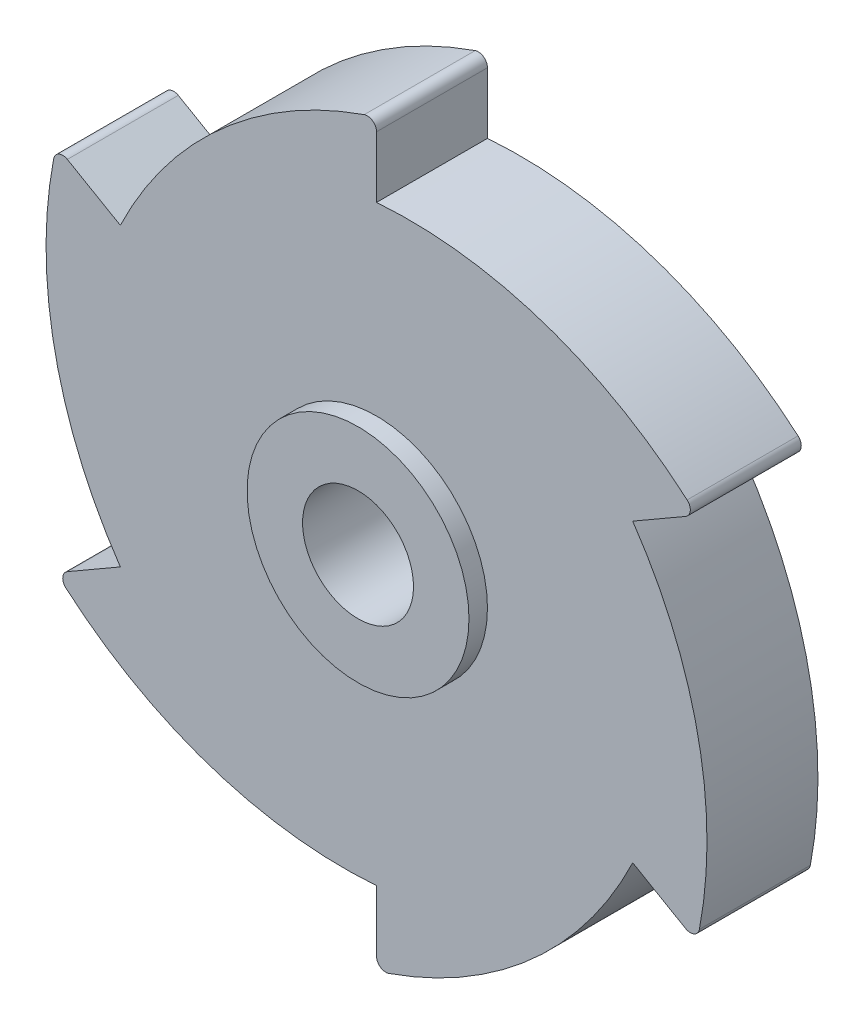
ISO-10303-21;
HEADER;
FILE_DESCRIPTION(('STEP AP214'),'2;1');
FILE_NAME('part.step','',(''),(''),'','','');
FILE_SCHEMA(('AUTOMOTIVE_DESIGN { 1 0 10303 214 1 1 1 1 }'));
ENDSEC;
DATA;
#1=APPLICATION_CONTEXT('core data for automotive mechanical design processes');
#2=APPLICATION_PROTOCOL_DEFINITION('international standard','automotive_design',2000,#1);
#3=PRODUCT_CONTEXT('',#1,'mechanical');
#4=PRODUCT('Part','Part','',(#3));
#5=PRODUCT_RELATED_PRODUCT_CATEGORY('part','',(#4));
#6=PRODUCT_DEFINITION_FORMATION('','',#4);
#7=PRODUCT_DEFINITION_CONTEXT('part definition',#1,'design');
#8=PRODUCT_DEFINITION('design','',#6,#7);
#9=PRODUCT_DEFINITION_SHAPE('','',#8);
#10=(LENGTH_UNIT() NAMED_UNIT(*) SI_UNIT(.MILLI.,.METRE.));
#11=(NAMED_UNIT(*) PLANE_ANGLE_UNIT() SI_UNIT($,.RADIAN.));
#12=(NAMED_UNIT(*) SI_UNIT($,.STERADIAN.) SOLID_ANGLE_UNIT());
#13=UNCERTAINTY_MEASURE_WITH_UNIT(LENGTH_MEASURE(1.E-05),#10,'distance_accuracy_value','');
#14=(GEOMETRIC_REPRESENTATION_CONTEXT(3) GLOBAL_UNCERTAINTY_ASSIGNED_CONTEXT((#13)) GLOBAL_UNIT_ASSIGNED_CONTEXT((#10,
#11,#12)) REPRESENTATION_CONTEXT('',''));
#15=CARTESIAN_POINT('',(0.,0.,0.));
#16=DIRECTION('',(0.,0.,1.));
#17=DIRECTION('',(1.,0.,0.));
#18=AXIS2_PLACEMENT_3D('',#15,#16,#17);
#19=CARTESIAN_POINT('',(0.,0.,6.));
#20=DIRECTION('',(0.,0.,1.));
#21=DIRECTION('',(1.,0.,0.));
#22=AXIS2_PLACEMENT_3D('',#19,#20,#21);
#23=PLANE('',#22);
#24=CARTESIAN_POINT('',(0.,0.,6.));
#25=DIRECTION('',(0.,0.,1.));
#26=DIRECTION('',(1.,0.,0.));
#27=AXIS2_PLACEMENT_3D('',#24,#25,#26);
#28=CIRCLE('',#27,6.);
#29=CARTESIAN_POINT('',(6.,0.,6.));
#30=VERTEX_POINT('',#29);
#31=EDGE_CURVE('E203',#30,#30,#28,.T.);
#32=ORIENTED_EDGE('',*,*,#31,.F.);
#33=EDGE_LOOP('',(#32));
#34=FACE_BOUND('',#33,.T.);
#35=DIRECTION('',(0.,1.,0.));
#36=VECTOR('',#35,1.);
#37=CARTESIAN_POINT('',(0.,-16.,6.));
#38=LINE('',#37,#36);
#39=CARTESIAN_POINT('',(0.,-19.3083090527774,6.));
#40=VERTEX_POINT('',#39);
#41=CARTESIAN_POINT('',(0.,-16.,6.));
#42=VERTEX_POINT('',#41);
#43=EDGE_CURVE('E284',#40,#42,#38,.T.);
#44=ORIENTED_EDGE('',*,*,#43,.F.);
#45=CARTESIAN_POINT('',(0.5,-19.3083090527774,6.));
#46=DIRECTION('',(0.,0.,1.));
#47=DIRECTION('',(1.,0.,0.));
#48=AXIS2_PLACEMENT_3D('',#45,#46,#47);
#49=CIRCLE('',#48,0.5);
#50=CARTESIAN_POINT('',(0.664038468492847,-19.7806345558518,6.));
#51=VERTEX_POINT('',#50);
#52=EDGE_CURVE('E317',#40,#51,#49,.T.);
#53=ORIENTED_EDGE('',*,*,#52,.T.);
#54=CARTESIAN_POINT('',(-6.88173108217818,1.94633858557233,6.));
#55=DIRECTION('',(0.,0.,1.));
#56=DIRECTION('',(1.,0.,0.));
#57=AXIS2_PLACEMENT_3D('',#54,#55,#56);
#58=CIRCLE('',#57,23.);
#59=CARTESIAN_POINT('',(13.8564064605511,-7.99999999999987,6.));
#60=VERTEX_POINT('',#59);
#61=EDGE_CURVE('E193',#60,#51,#58,.F.);
#62=ORIENTED_EDGE('',*,*,#61,.F.);
#63=DIRECTION('',(-0.866025403784443,0.499999999999992,0.));
#64=VECTOR('',#63,1.);
#65=CARTESIAN_POINT('',(13.8564064605511,-7.99999999999987,6.));
#66=LINE('',#65,#64);
#67=CARTESIAN_POINT('',(16.7214861438263,-9.65415452638851,6.));
#68=VERTEX_POINT('',#67);
#69=EDGE_CURVE('E188',#68,#60,#66,.T.);
#70=ORIENTED_EDGE('',*,*,#69,.F.);
#71=CARTESIAN_POINT('',(16.9714861438263,-9.22114182449629,6.));
#72=DIRECTION('',(0.,0.,1.));
#73=DIRECTION('',(1.,0.,0.));
#74=AXIS2_PLACEMENT_3D('',#71,#72,#73);
#75=CIRCLE('',#74,0.5);
#76=CARTESIAN_POINT('',(17.4625512625905,-9.3152430951208,6.));
#77=VERTEX_POINT('',#76);
#78=EDGE_CURVE('E308',#68,#77,#75,.T.);
#79=ORIENTED_EDGE('',*,*,#78,.T.);
#80=CARTESIAN_POINT('',(-5.12644420056059,-4.98658464639313,6.));
#81=DIRECTION('',(0.,0.,1.));
#82=DIRECTION('',(1.,0.,0.));
#83=AXIS2_PLACEMENT_3D('',#80,#81,#82);
#84=CIRCLE('',#83,23.);
#85=CARTESIAN_POINT('',(13.8564064605509,8.00000000000016,6.));
#86=VERTEX_POINT('',#85);
#87=EDGE_CURVE('E283',#86,#77,#84,.F.);
#88=ORIENTED_EDGE('',*,*,#87,.F.);
#89=DIRECTION('',(-0.866025403784433,-0.50000000000001,0.));
#90=VECTOR('',#89,1.);
#91=CARTESIAN_POINT('',(13.8564064605509,8.00000000000016,6.));
#92=LINE('',#91,#90);
#93=CARTESIAN_POINT('',(16.721486143826,9.65415452638882,6.));
#94=VERTEX_POINT('',#93);
#95=EDGE_CURVE('E261',#94,#86,#92,.T.);
#96=ORIENTED_EDGE('',*,*,#95,.F.);
#97=CARTESIAN_POINT('',(16.471486143826,10.087167228281,6.));
#98=DIRECTION('',(0.,0.,1.));
#99=DIRECTION('',(1.,0.,0.));
#100=AXIS2_PLACEMENT_3D('',#97,#98,#99);
#101=CIRCLE('',#100,0.5);
#102=CARTESIAN_POINT('',(16.7985127940973,10.465391460731,6.));
#103=VERTEX_POINT('',#102);
#104=EDGE_CURVE('E305',#94,#103,#101,.T.);
#105=ORIENTED_EDGE('',*,*,#104,.T.);
#106=CARTESIAN_POINT('',(1.75528688161752,-6.93292323196546,6.));
#107=DIRECTION('',(0.,0.,1.));
#108=DIRECTION('',(1.,0.,0.));
#109=AXIS2_PLACEMENT_3D('',#106,#107,#108);
#110=CIRCLE('',#109,23.);
#111=CARTESIAN_POINT('',(0.,16.,6.));
#112=VERTEX_POINT('',#111);
#113=EDGE_CURVE('E276',#112,#103,#110,.F.);
#114=ORIENTED_EDGE('',*,*,#113,.F.);
#115=DIRECTION('',(0.,1.,0.));
#116=VECTOR('',#115,1.);
#117=CARTESIAN_POINT('',(0.,16.,6.));
#118=LINE('',#117,#116);
#119=CARTESIAN_POINT('',(0.,19.3083090527773,6.));
#120=VERTEX_POINT('',#119);
#121=EDGE_CURVE('E273',#120,#112,#118,.F.);
#122=ORIENTED_EDGE('',*,*,#121,.F.);
#123=CARTESIAN_POINT('',(-0.5,19.3083090527773,6.));
#124=DIRECTION('',(0.,0.,1.));
#125=DIRECTION('',(1.,0.,0.));
#126=AXIS2_PLACEMENT_3D('',#123,#124,#125);
#127=CIRCLE('',#126,0.5);
#128=CARTESIAN_POINT('',(-0.66403846849285,19.7806345558518,6.));
#129=VERTEX_POINT('',#128);
#130=EDGE_CURVE('E302',#120,#129,#127,.T.);
#131=ORIENTED_EDGE('',*,*,#130,.T.);
#132=CARTESIAN_POINT('',(6.88173108217817,-1.94633858557238,6.));
#133=DIRECTION('',(0.,0.,1.));
#134=DIRECTION('',(1.,0.,0.));
#135=AXIS2_PLACEMENT_3D('',#132,#133,#134);
#136=CIRCLE('',#135,23.);
#137=CARTESIAN_POINT('',(-13.856406460551,7.99999999999997,6.));
#138=VERTEX_POINT('',#137);
#139=EDGE_CURVE('E238',#138,#129,#136,.F.);
#140=ORIENTED_EDGE('',*,*,#139,.F.);
#141=DIRECTION('',(0.86602540378444,-0.499999999999998,0.));
#142=VECTOR('',#141,1.);
#143=CARTESIAN_POINT('',(-13.856406460551,7.99999999999997,6.));
#144=LINE('',#143,#142);
#145=CARTESIAN_POINT('',(-16.7214861438262,9.65415452638863,6.));
#146=VERTEX_POINT('',#145);
#147=EDGE_CURVE('E266',#146,#138,#144,.T.);
#148=ORIENTED_EDGE('',*,*,#147,.F.);
#149=CARTESIAN_POINT('',(-16.9714861438262,9.22114182449641,6.));
#150=DIRECTION('',(0.,0.,1.));
#151=DIRECTION('',(1.,0.,0.));
#152=AXIS2_PLACEMENT_3D('',#149,#150,#151);
#153=CIRCLE('',#152,0.5);
#154=CARTESIAN_POINT('',(-17.4625512625904,9.31524309512093,6.));
#155=VERTEX_POINT('',#154);
#156=EDGE_CURVE('E311',#146,#155,#153,.T.);
#157=ORIENTED_EDGE('',*,*,#156,.T.);
#158=CARTESIAN_POINT('',(5.12644420056063,4.9865846463931,6.));
#159=DIRECTION('',(0.,0.,1.));
#160=DIRECTION('',(1.,0.,0.));
#161=AXIS2_PLACEMENT_3D('',#158,#159,#160);
#162=CIRCLE('',#161,23.);
#163=CARTESIAN_POINT('',(-13.856406460551,-8.00000000000007,6.));
#164=VERTEX_POINT('',#163);
#165=EDGE_CURVE('E221',#164,#155,#162,.F.);
#166=ORIENTED_EDGE('',*,*,#165,.F.);
#167=DIRECTION('',(0.866025403784436,0.500000000000004,0.));
#168=VECTOR('',#167,1.);
#169=CARTESIAN_POINT('',(-13.856406460551,-8.00000000000007,6.));
#170=LINE('',#169,#168);
#171=CARTESIAN_POINT('',(-16.7214861438261,-9.65415452638872,6.));
#172=VERTEX_POINT('',#171);
#173=EDGE_CURVE('E220',#172,#164,#170,.T.);
#174=ORIENTED_EDGE('',*,*,#173,.F.);
#175=CARTESIAN_POINT('',(-16.4714861438261,-10.0871672282809,6.));
#176=DIRECTION('',(0.,0.,1.));
#177=DIRECTION('',(1.,0.,0.));
#178=AXIS2_PLACEMENT_3D('',#175,#176,#177);
#179=CIRCLE('',#178,0.5);
#180=CARTESIAN_POINT('',(-16.7985127940974,-10.4653914607309,6.));
#181=VERTEX_POINT('',#180);
#182=EDGE_CURVE('E314',#172,#181,#179,.T.);
#183=ORIENTED_EDGE('',*,*,#182,.T.);
#184=CARTESIAN_POINT('',(-1.75528688161752,6.93292323196546,6.));
#185=DIRECTION('',(0.,0.,1.));
#186=DIRECTION('',(1.,0.,0.));
#187=AXIS2_PLACEMENT_3D('',#184,#185,#186);
#188=CIRCLE('',#187,23.);
#189=EDGE_CURVE('E287',#42,#181,#188,.F.);
#190=ORIENTED_EDGE('',*,*,#189,.F.);
#191=EDGE_LOOP('',(#44,#53,#62,#70,#79,#88,#96,#105,#114,#122,#131,#140,#148,#157,#166,#174,
#183,#190));
#192=FACE_BOUND('',#191,.T.);
#193=ADVANCED_FACE('F43',(#34,#192),#23,.T.);
#194=CARTESIAN_POINT('',(0.,0.,0.));
#195=DIRECTION('',(0.,0.,1.));
#196=DIRECTION('',(1.,0.,0.));
#197=AXIS2_PLACEMENT_3D('',#194,#195,#196);
#198=PLANE('',#197);
#199=CARTESIAN_POINT('',(0.,0.,0.));
#200=DIRECTION('',(0.,0.,-1.));
#201=DIRECTION('',(-1.,0.,0.));
#202=AXIS2_PLACEMENT_3D('',#199,#200,#201);
#203=CIRCLE('',#202,6.);
#204=CARTESIAN_POINT('',(-6.,0.,0.));
#205=VERTEX_POINT('',#204);
#206=EDGE_CURVE('E702',#205,#205,#203,.T.);
#207=ORIENTED_EDGE('',*,*,#206,.F.);
#208=EDGE_LOOP('',(#207));
#209=FACE_BOUND('',#208,.T.);
#210=CARTESIAN_POINT('',(-6.88173108217818,1.94633858557233,0.));
#211=DIRECTION('',(0.,0.,-1.));
#212=DIRECTION('',(-0.499999999999992,-0.866025403784443,0.));
#213=AXIS2_PLACEMENT_3D('',#210,#211,#212);
#214=CIRCLE('',#213,23.);
#215=CARTESIAN_POINT('',(13.8564064605511,-7.99999999999987,0.));
#216=VERTEX_POINT('',#215);
#217=CARTESIAN_POINT('',(0.664038468492847,-19.7806345558518,0.));
#218=VERTEX_POINT('',#217);
#219=EDGE_CURVE('E175',#216,#218,#214,.T.);
#220=ORIENTED_EDGE('',*,*,#219,.T.);
#221=CARTESIAN_POINT('',(0.5,-19.3083090527774,0.));
#222=DIRECTION('',(0.,0.,1.));
#223=DIRECTION('',(1.,0.,0.));
#224=AXIS2_PLACEMENT_3D('',#221,#222,#223);
#225=CIRCLE('',#224,0.5);
#226=CARTESIAN_POINT('',(0.,-19.3083090527774,0.));
#227=VERTEX_POINT('',#226);
#228=EDGE_CURVE('E335',#218,#227,#225,.F.);
#229=ORIENTED_EDGE('',*,*,#228,.T.);
#230=DIRECTION('',(0.,1.,0.));
#231=VECTOR('',#230,1.);
#232=CARTESIAN_POINT('',(0.,-16.,0.));
#233=LINE('',#232,#231);
#234=CARTESIAN_POINT('',(0.,-16.,0.));
#235=VERTEX_POINT('',#234);
#236=EDGE_CURVE('E243',#227,#235,#233,.T.);
#237=ORIENTED_EDGE('',*,*,#236,.T.);
#238=CARTESIAN_POINT('',(-1.75528688161752,6.93292323196546,0.));
#239=DIRECTION('',(0.,0.,-1.));
#240=DIRECTION('',(-1.,0.,0.));
#241=AXIS2_PLACEMENT_3D('',#238,#239,#240);
#242=CIRCLE('',#241,23.);
#243=CARTESIAN_POINT('',(-16.7985127940974,-10.4653914607309,0.));
#244=VERTEX_POINT('',#243);
#245=EDGE_CURVE('E239',#235,#244,#242,.T.);
#246=ORIENTED_EDGE('',*,*,#245,.T.);
#247=CARTESIAN_POINT('',(-16.4714861438261,-10.0871672282809,0.));
#248=DIRECTION('',(0.,0.,1.));
#249=DIRECTION('',(1.,0.,0.));
#250=AXIS2_PLACEMENT_3D('',#247,#248,#249);
#251=CIRCLE('',#250,0.5);
#252=CARTESIAN_POINT('',(-16.7214861438261,-9.65415452638872,0.));
#253=VERTEX_POINT('',#252);
#254=EDGE_CURVE('E332',#244,#253,#251,.F.);
#255=ORIENTED_EDGE('',*,*,#254,.T.);
#256=DIRECTION('',(0.866025403784436,0.500000000000004,0.));
#257=VECTOR('',#256,1.);
#258=CARTESIAN_POINT('',(-13.856406460551,-8.00000000000007,0.));
#259=LINE('',#258,#257);
#260=CARTESIAN_POINT('',(-13.856406460551,-8.00000000000007,0.));
#261=VERTEX_POINT('',#260);
#262=EDGE_CURVE('E213',#253,#261,#259,.T.);
#263=ORIENTED_EDGE('',*,*,#262,.T.);
#264=CARTESIAN_POINT('',(5.12644420056063,4.9865846463931,0.));
#265=DIRECTION('',(0.,0.,-1.));
#266=DIRECTION('',(-0.500000000000004,0.866025403784436,0.));
#267=AXIS2_PLACEMENT_3D('',#264,#265,#266);
#268=CIRCLE('',#267,23.);
#269=CARTESIAN_POINT('',(-17.4625512625904,9.31524309512093,0.));
#270=VERTEX_POINT('',#269);
#271=EDGE_CURVE('E209',#261,#270,#268,.T.);
#272=ORIENTED_EDGE('',*,*,#271,.T.);
#273=CARTESIAN_POINT('',(-16.9714861438262,9.22114182449641,0.));
#274=DIRECTION('',(0.,0.,1.));
#275=DIRECTION('',(1.,0.,0.));
#276=AXIS2_PLACEMENT_3D('',#273,#274,#275);
#277=CIRCLE('',#276,0.5);
#278=CARTESIAN_POINT('',(-16.7214861438262,9.65415452638863,0.));
#279=VERTEX_POINT('',#278);
#280=EDGE_CURVE('E329',#270,#279,#277,.F.);
#281=ORIENTED_EDGE('',*,*,#280,.T.);
#282=DIRECTION('',(0.86602540378444,-0.499999999999998,0.));
#283=VECTOR('',#282,1.);
#284=CARTESIAN_POINT('',(-13.856406460551,7.99999999999997,0.));
#285=LINE('',#284,#283);
#286=CARTESIAN_POINT('',(-13.856406460551,7.99999999999997,0.));
#287=VERTEX_POINT('',#286);
#288=EDGE_CURVE('E230',#279,#287,#285,.T.);
#289=ORIENTED_EDGE('',*,*,#288,.T.);
#290=CARTESIAN_POINT('',(6.88173108217817,-1.94633858557238,0.));
#291=DIRECTION('',(0.,0.,-1.));
#292=DIRECTION('',(0.499999999999998,0.86602540378444,0.));
#293=AXIS2_PLACEMENT_3D('',#290,#291,#292);
#294=CIRCLE('',#293,23.);
#295=CARTESIAN_POINT('',(-0.66403846849285,19.7806345558518,0.));
#296=VERTEX_POINT('',#295);
#297=EDGE_CURVE('E226',#287,#296,#294,.T.);
#298=ORIENTED_EDGE('',*,*,#297,.T.);
#299=CARTESIAN_POINT('',(-0.5,19.3083090527773,0.));
#300=DIRECTION('',(0.,0.,1.));
#301=DIRECTION('',(1.,0.,0.));
#302=AXIS2_PLACEMENT_3D('',#299,#300,#301);
#303=CIRCLE('',#302,0.5);
#304=CARTESIAN_POINT('',(0.,19.3083090527773,0.));
#305=VERTEX_POINT('',#304);
#306=EDGE_CURVE('E322',#296,#305,#303,.F.);
#307=ORIENTED_EDGE('',*,*,#306,.T.);
#308=DIRECTION('',(0.,-1.,0.));
#309=VECTOR('',#308,1.);
#310=CARTESIAN_POINT('',(0.,16.,0.));
#311=LINE('',#310,#309);
#312=CARTESIAN_POINT('',(0.,16.,0.));
#313=VERTEX_POINT('',#312);
#314=EDGE_CURVE('E265',#305,#313,#311,.T.);
#315=ORIENTED_EDGE('',*,*,#314,.T.);
#316=CARTESIAN_POINT('',(1.75528688161752,-6.93292323196546,0.));
#317=DIRECTION('',(0.,0.,-1.));
#318=DIRECTION('',(1.,0.,0.));
#319=AXIS2_PLACEMENT_3D('',#316,#317,#318);
#320=CIRCLE('',#319,23.);
#321=CARTESIAN_POINT('',(16.7985127940973,10.465391460731,0.));
#322=VERTEX_POINT('',#321);
#323=EDGE_CURVE('E262',#313,#322,#320,.T.);
#324=ORIENTED_EDGE('',*,*,#323,.T.);
#325=CARTESIAN_POINT('',(16.471486143826,10.087167228281,0.));
#326=DIRECTION('',(0.,0.,1.));
#327=DIRECTION('',(1.,0.,0.));
#328=AXIS2_PLACEMENT_3D('',#325,#326,#327);
#329=CIRCLE('',#328,0.5);
#330=CARTESIAN_POINT('',(16.721486143826,9.65415452638882,0.));
#331=VERTEX_POINT('',#330);
#332=EDGE_CURVE('E68',#322,#331,#329,.F.);
#333=ORIENTED_EDGE('',*,*,#332,.T.);
#334=DIRECTION('',(-0.866025403784433,-0.50000000000001,0.));
#335=VECTOR('',#334,1.);
#336=CARTESIAN_POINT('',(13.8564064605509,8.00000000000016,0.));
#337=LINE('',#336,#335);
#338=CARTESIAN_POINT('',(13.8564064605509,8.00000000000016,0.));
#339=VERTEX_POINT('',#338);
#340=EDGE_CURVE('E252',#331,#339,#337,.T.);
#341=ORIENTED_EDGE('',*,*,#340,.T.);
#342=CARTESIAN_POINT('',(-5.12644420056059,-4.98658464639313,0.));
#343=DIRECTION('',(0.,0.,-1.));
#344=DIRECTION('',(0.50000000000001,-0.866025403784433,0.));
#345=AXIS2_PLACEMENT_3D('',#342,#343,#344);
#346=CIRCLE('',#345,23.);
#347=CARTESIAN_POINT('',(17.4625512625905,-9.3152430951208,0.));
#348=VERTEX_POINT('',#347);
#349=EDGE_CURVE('E225',#339,#348,#346,.T.);
#350=ORIENTED_EDGE('',*,*,#349,.T.);
#351=CARTESIAN_POINT('',(16.9714861438263,-9.22114182449629,0.));
#352=DIRECTION('',(0.,0.,1.));
#353=DIRECTION('',(1.,0.,0.));
#354=AXIS2_PLACEMENT_3D('',#351,#352,#353);
#355=CIRCLE('',#354,0.5);
#356=CARTESIAN_POINT('',(16.7214861438263,-9.65415452638851,0.));
#357=VERTEX_POINT('',#356);
#358=EDGE_CURVE('E178',#348,#357,#355,.F.);
#359=ORIENTED_EDGE('',*,*,#358,.T.);
#360=DIRECTION('',(-0.866025403784443,0.499999999999992,0.));
#361=VECTOR('',#360,1.);
#362=CARTESIAN_POINT('',(13.8564064605511,-7.99999999999987,0.));
#363=LINE('',#362,#361);
#364=EDGE_CURVE('E171',#357,#216,#363,.T.);
#365=ORIENTED_EDGE('',*,*,#364,.T.);
#366=EDGE_LOOP('',(#220,#229,#237,#246,#255,#263,#272,#281,#289,#298,#307,#315,#324,#333,#341,
#350,#359,#365));
#367=FACE_BOUND('',#366,.T.);
#368=ADVANCED_FACE('F173',(#209,#367),#198,.F.);
#369=CARTESIAN_POINT('',(1.75528688161752,-6.93292323196546,0.));
#370=DIRECTION('',(0.,0.,1.));
#371=DIRECTION('',(1.,0.,0.));
#372=AXIS2_PLACEMENT_3D('',#369,#370,#371);
#373=CYLINDRICAL_SURFACE('',#372,23.);
#374=ORIENTED_EDGE('',*,*,#113,.T.);
#375=DIRECTION('',(0.,0.,1.));
#376=VECTOR('',#375,1.);
#377=CARTESIAN_POINT('',(16.7985127940973,10.465391460731,0.));
#378=LINE('',#377,#376);
#379=EDGE_CURVE('E361',#103,#322,#378,.F.);
#380=ORIENTED_EDGE('',*,*,#379,.T.);
#381=ORIENTED_EDGE('',*,*,#323,.F.);
#382=DIRECTION('',(0.,0.,1.));
#383=VECTOR('',#382,1.);
#384=CARTESIAN_POINT('',(0.,16.,0.));
#385=LINE('',#384,#383);
#386=EDGE_CURVE('E269',#313,#112,#385,.T.);
#387=ORIENTED_EDGE('',*,*,#386,.T.);
#388=EDGE_LOOP('',(#374,#380,#381,#387));
#389=FACE_BOUND('',#388,.T.);
#390=ADVANCED_FACE('F381',(#389),#373,.T.);
#391=CARTESIAN_POINT('',(0.,16.,0.));
#392=DIRECTION('',(-1.,0.,0.));
#393=DIRECTION('',(0.,0.,1.));
#394=AXIS2_PLACEMENT_3D('',#391,#392,#393);
#395=PLANE('',#394);
#396=ORIENTED_EDGE('',*,*,#314,.F.);
#397=DIRECTION('',(0.,0.,1.));
#398=VECTOR('',#397,1.);
#399=CARTESIAN_POINT('',(0.,19.3083090527773,0.));
#400=LINE('',#399,#398);
#401=EDGE_CURVE('E53',#305,#120,#400,.T.);
#402=ORIENTED_EDGE('',*,*,#401,.T.);
#403=ORIENTED_EDGE('',*,*,#121,.T.);
#404=ORIENTED_EDGE('',*,*,#386,.F.);
#405=EDGE_LOOP('',(#396,#402,#403,#404));
#406=FACE_BOUND('',#405,.T.);
#407=ADVANCED_FACE('F370',(#406),#395,.F.);
#408=CARTESIAN_POINT('',(6.88173108217817,-1.94633858557238,0.));
#409=DIRECTION('',(0.,0.,1.));
#410=DIRECTION('',(1.,0.,0.));
#411=AXIS2_PLACEMENT_3D('',#408,#409,#410);
#412=CYLINDRICAL_SURFACE('',#411,23.);
#413=ORIENTED_EDGE('',*,*,#139,.T.);
#414=DIRECTION('',(0.,0.,1.));
#415=VECTOR('',#414,1.);
#416=CARTESIAN_POINT('',(-0.664038468492849,19.7806345558518,0.));
#417=LINE('',#416,#415);
#418=EDGE_CURVE('E11',#129,#296,#417,.F.);
#419=ORIENTED_EDGE('',*,*,#418,.T.);
#420=ORIENTED_EDGE('',*,*,#297,.F.);
#421=DIRECTION('',(0.,0.,1.));
#422=VECTOR('',#421,1.);
#423=CARTESIAN_POINT('',(-13.856406460551,7.99999999999997,0.));
#424=LINE('',#423,#422);
#425=EDGE_CURVE('E234',#287,#138,#424,.T.);
#426=ORIENTED_EDGE('',*,*,#425,.T.);
#427=EDGE_LOOP('',(#413,#419,#420,#426));
#428=FACE_BOUND('',#427,.T.);
#429=ADVANCED_FACE('F429',(#428),#412,.T.);
#430=CARTESIAN_POINT('',(-13.856406460551,7.99999999999997,0.));
#431=DIRECTION('',(-0.499999999999998,-0.86602540378444,0.));
#432=DIRECTION('',(0.86602540378444,-0.499999999999998,0.));
#433=AXIS2_PLACEMENT_3D('',#430,#431,#432);
#434=PLANE('',#433);
#435=ORIENTED_EDGE('',*,*,#288,.F.);
#436=DIRECTION('',(0.,0.,1.));
#437=VECTOR('',#436,1.);
#438=CARTESIAN_POINT('',(-16.7214861438262,9.65415452638863,0.));
#439=LINE('',#438,#437);
#440=EDGE_CURVE('E345',#279,#146,#439,.T.);
#441=ORIENTED_EDGE('',*,*,#440,.T.);
#442=ORIENTED_EDGE('',*,*,#147,.T.);
#443=ORIENTED_EDGE('',*,*,#425,.F.);
#444=EDGE_LOOP('',(#435,#441,#442,#443));
#445=FACE_BOUND('',#444,.T.);
#446=ADVANCED_FACE('F425',(#445),#434,.F.);
#447=CARTESIAN_POINT('',(-5.12644420056059,-4.98658464639313,0.));
#448=DIRECTION('',(0.,0.,1.));
#449=DIRECTION('',(1.,0.,0.));
#450=AXIS2_PLACEMENT_3D('',#447,#448,#449);
#451=CYLINDRICAL_SURFACE('',#450,23.);
#452=ORIENTED_EDGE('',*,*,#87,.T.);
#453=DIRECTION('',(0.,0.,1.));
#454=VECTOR('',#453,1.);
#455=CARTESIAN_POINT('',(17.4625512625905,-9.3152430951208,0.));
#456=LINE('',#455,#454);
#457=EDGE_CURVE('E60',#77,#348,#456,.F.);
#458=ORIENTED_EDGE('',*,*,#457,.T.);
#459=ORIENTED_EDGE('',*,*,#349,.F.);
#460=DIRECTION('',(0.,0.,1.));
#461=VECTOR('',#460,1.);
#462=CARTESIAN_POINT('',(13.8564064605509,8.00000000000016,0.));
#463=LINE('',#462,#461);
#464=EDGE_CURVE('E244',#339,#86,#463,.T.);
#465=ORIENTED_EDGE('',*,*,#464,.T.);
#466=EDGE_LOOP('',(#452,#458,#459,#465));
#467=FACE_BOUND('',#466,.T.);
#468=ADVANCED_FACE('F390',(#467),#451,.T.);
#469=CARTESIAN_POINT('',(13.8564064605509,8.00000000000016,0.));
#470=DIRECTION('',(-0.50000000000001,0.866025403784433,0.));
#471=DIRECTION('',(-0.866025403784433,-0.50000000000001,0.));
#472=AXIS2_PLACEMENT_3D('',#469,#470,#471);
#473=PLANE('',#472);
#474=ORIENTED_EDGE('',*,*,#340,.F.);
#475=DIRECTION('',(0.,0.,1.));
#476=VECTOR('',#475,1.);
#477=CARTESIAN_POINT('',(16.721486143826,9.65415452638882,0.));
#478=LINE('',#477,#476);
#479=EDGE_CURVE('E357',#331,#94,#478,.T.);
#480=ORIENTED_EDGE('',*,*,#479,.T.);
#481=ORIENTED_EDGE('',*,*,#95,.T.);
#482=ORIENTED_EDGE('',*,*,#464,.F.);
#483=EDGE_LOOP('',(#474,#480,#481,#482));
#484=FACE_BOUND('',#483,.T.);
#485=ADVANCED_FACE('F387',(#484),#473,.F.);
#486=CARTESIAN_POINT('',(-1.75528688161752,6.93292323196546,0.));
#487=DIRECTION('',(0.,0.,1.));
#488=DIRECTION('',(1.,0.,0.));
#489=AXIS2_PLACEMENT_3D('',#486,#487,#488);
#490=CYLINDRICAL_SURFACE('',#489,23.);
#491=ORIENTED_EDGE('',*,*,#189,.T.);
#492=DIRECTION('',(0.,0.,1.));
#493=VECTOR('',#492,1.);
#494=CARTESIAN_POINT('',(-16.7985127940974,-10.4653914607309,0.));
#495=LINE('',#494,#493);
#496=EDGE_CURVE('E342',#181,#244,#495,.F.);
#497=ORIENTED_EDGE('',*,*,#496,.T.);
#498=ORIENTED_EDGE('',*,*,#245,.F.);
#499=DIRECTION('',(0.,0.,1.));
#500=VECTOR('',#499,1.);
#501=CARTESIAN_POINT('',(0.,-16.,0.));
#502=LINE('',#501,#500);
#503=EDGE_CURVE('E231',#235,#42,#502,.T.);
#504=ORIENTED_EDGE('',*,*,#503,.T.);
#505=EDGE_LOOP('',(#491,#497,#498,#504));
#506=FACE_BOUND('',#505,.T.);
#507=ADVANCED_FACE('F403',(#506),#490,.T.);
#508=CARTESIAN_POINT('',(0.,-16.,0.));
#509=DIRECTION('',(1.,0.,0.));
#510=DIRECTION('',(0.,0.,-1.));
#511=AXIS2_PLACEMENT_3D('',#508,#509,#510);
#512=PLANE('',#511);
#513=ORIENTED_EDGE('',*,*,#236,.F.);
#514=DIRECTION('',(0.,0.,1.));
#515=VECTOR('',#514,1.);
#516=CARTESIAN_POINT('',(0.,-19.3083090527774,0.));
#517=LINE('',#516,#515);
#518=EDGE_CURVE('E280',#227,#40,#517,.T.);
#519=ORIENTED_EDGE('',*,*,#518,.T.);
#520=ORIENTED_EDGE('',*,*,#43,.T.);
#521=ORIENTED_EDGE('',*,*,#503,.F.);
#522=EDGE_LOOP('',(#513,#519,#520,#521));
#523=FACE_BOUND('',#522,.T.);
#524=ADVANCED_FACE('F400',(#523),#512,.F.);
#525=CARTESIAN_POINT('',(5.12644420056063,4.9865846463931,0.));
#526=DIRECTION('',(0.,0.,1.));
#527=DIRECTION('',(1.,0.,0.));
#528=AXIS2_PLACEMENT_3D('',#525,#526,#527);
#529=CYLINDRICAL_SURFACE('',#528,23.);
#530=ORIENTED_EDGE('',*,*,#165,.T.);
#531=DIRECTION('',(0.,0.,1.));
#532=VECTOR('',#531,1.);
#533=CARTESIAN_POINT('',(-17.4625512625904,9.31524309512093,0.));
#534=LINE('',#533,#532);
#535=EDGE_CURVE('E349',#155,#270,#534,.F.);
#536=ORIENTED_EDGE('',*,*,#535,.T.);
#537=ORIENTED_EDGE('',*,*,#271,.F.);
#538=DIRECTION('',(0.,0.,1.));
#539=VECTOR('',#538,1.);
#540=CARTESIAN_POINT('',(-13.856406460551,-8.00000000000007,0.));
#541=LINE('',#540,#539);
#542=EDGE_CURVE('E216',#261,#164,#541,.T.);
#543=ORIENTED_EDGE('',*,*,#542,.T.);
#544=EDGE_LOOP('',(#530,#536,#537,#543));
#545=FACE_BOUND('',#544,.T.);
#546=ADVANCED_FACE('F590',(#545),#529,.T.);
#547=CARTESIAN_POINT('',(-13.856406460551,-8.00000000000007,0.));
#548=DIRECTION('',(0.500000000000004,-0.866025403784436,0.));
#549=DIRECTION('',(0.866025403784436,0.500000000000004,0.));
#550=AXIS2_PLACEMENT_3D('',#547,#548,#549);
#551=PLANE('',#550);
#552=ORIENTED_EDGE('',*,*,#262,.F.);
#553=DIRECTION('',(0.,0.,1.));
#554=VECTOR('',#553,1.);
#555=CARTESIAN_POINT('',(-16.7214861438261,-9.65415452638872,0.));
#556=LINE('',#555,#554);
#557=EDGE_CURVE('E338',#253,#172,#556,.T.);
#558=ORIENTED_EDGE('',*,*,#557,.T.);
#559=ORIENTED_EDGE('',*,*,#173,.T.);
#560=ORIENTED_EDGE('',*,*,#542,.F.);
#561=EDGE_LOOP('',(#552,#558,#559,#560));
#562=FACE_BOUND('',#561,.T.);
#563=ADVANCED_FACE('F413',(#562),#551,.F.);
#564=CARTESIAN_POINT('',(-6.88173108217818,1.94633858557233,0.));
#565=DIRECTION('',(0.,0.,1.));
#566=DIRECTION('',(1.,0.,0.));
#567=AXIS2_PLACEMENT_3D('',#564,#565,#566);
#568=CYLINDRICAL_SURFACE('',#567,23.);
#569=ORIENTED_EDGE('',*,*,#61,.T.);
#570=DIRECTION('',(0.,0.,1.));
#571=VECTOR('',#570,1.);
#572=CARTESIAN_POINT('',(0.664038468492849,-19.7806345558518,0.));
#573=LINE('',#572,#571);
#574=EDGE_CURVE('E197',#51,#218,#573,.F.);
#575=ORIENTED_EDGE('',*,*,#574,.T.);
#576=ORIENTED_EDGE('',*,*,#219,.F.);
#577=DIRECTION('',(0.,0.,1.));
#578=VECTOR('',#577,1.);
#579=CARTESIAN_POINT('',(13.8564064605511,-7.99999999999987,0.));
#580=LINE('',#579,#578);
#581=EDGE_CURVE('E183',#216,#60,#580,.T.);
#582=ORIENTED_EDGE('',*,*,#581,.T.);
#583=EDGE_LOOP('',(#569,#575,#576,#582));
#584=FACE_BOUND('',#583,.T.);
#585=ADVANCED_FACE('F195',(#584),#568,.T.);
#586=CARTESIAN_POINT('',(13.8564064605511,-7.99999999999987,0.));
#587=DIRECTION('',(0.499999999999992,0.866025403784443,0.));
#588=DIRECTION('',(-0.866025403784443,0.499999999999992,0.));
#589=AXIS2_PLACEMENT_3D('',#586,#587,#588);
#590=PLANE('',#589);
#591=ORIENTED_EDGE('',*,*,#364,.F.);
#592=DIRECTION('',(0.,0.,1.));
#593=VECTOR('',#592,1.);
#594=CARTESIAN_POINT('',(16.7214861438263,-9.65415452638851,0.));
#595=LINE('',#594,#593);
#596=EDGE_CURVE('E352',#357,#68,#595,.T.);
#597=ORIENTED_EDGE('',*,*,#596,.T.);
#598=ORIENTED_EDGE('',*,*,#69,.T.);
#599=ORIENTED_EDGE('',*,*,#581,.F.);
#600=EDGE_LOOP('',(#591,#597,#598,#599));
#601=FACE_BOUND('',#600,.T.);
#602=ADVANCED_FACE('F186',(#601),#590,.F.);
#603=CARTESIAN_POINT('',(0.5,-19.3083090527774,0.));
#604=DIRECTION('',(0.,0.,1.));
#605=DIRECTION('',(1.,0.,0.));
#606=AXIS2_PLACEMENT_3D('',#603,#604,#605);
#607=CYLINDRICAL_SURFACE('',#606,0.5);
#608=ORIENTED_EDGE('',*,*,#228,.F.);
#609=ORIENTED_EDGE('',*,*,#574,.F.);
#610=ORIENTED_EDGE('',*,*,#52,.F.);
#611=ORIENTED_EDGE('',*,*,#518,.F.);
#612=EDGE_LOOP('',(#608,#609,#610,#611));
#613=FACE_BOUND('',#612,.T.);
#614=ADVANCED_FACE('F394',(#613),#607,.T.);
#615=CARTESIAN_POINT('',(-16.4714861438261,-10.0871672282809,0.));
#616=DIRECTION('',(0.,0.,1.));
#617=DIRECTION('',(1.,0.,0.));
#618=AXIS2_PLACEMENT_3D('',#615,#616,#617);
#619=CYLINDRICAL_SURFACE('',#618,0.5);
#620=ORIENTED_EDGE('',*,*,#254,.F.);
#621=ORIENTED_EDGE('',*,*,#496,.F.);
#622=ORIENTED_EDGE('',*,*,#182,.F.);
#623=ORIENTED_EDGE('',*,*,#557,.F.);
#624=EDGE_LOOP('',(#620,#621,#622,#623));
#625=FACE_BOUND('',#624,.T.);
#626=ADVANCED_FACE('F410',(#625),#619,.T.);
#627=CARTESIAN_POINT('',(-16.9714861438262,9.22114182449641,0.));
#628=DIRECTION('',(0.,0.,1.));
#629=DIRECTION('',(1.,0.,0.));
#630=AXIS2_PLACEMENT_3D('',#627,#628,#629);
#631=CYLINDRICAL_SURFACE('',#630,0.5);
#632=ORIENTED_EDGE('',*,*,#280,.F.);
#633=ORIENTED_EDGE('',*,*,#535,.F.);
#634=ORIENTED_EDGE('',*,*,#156,.F.);
#635=ORIENTED_EDGE('',*,*,#440,.F.);
#636=EDGE_LOOP('',(#632,#633,#634,#635));
#637=FACE_BOUND('',#636,.T.);
#638=ADVANCED_FACE('F422',(#637),#631,.T.);
#639=CARTESIAN_POINT('',(16.9714861438263,-9.22114182449629,0.));
#640=DIRECTION('',(0.,0.,1.));
#641=DIRECTION('',(1.,0.,0.));
#642=AXIS2_PLACEMENT_3D('',#639,#640,#641);
#643=CYLINDRICAL_SURFACE('',#642,0.5);
#644=ORIENTED_EDGE('',*,*,#358,.F.);
#645=ORIENTED_EDGE('',*,*,#457,.F.);
#646=ORIENTED_EDGE('',*,*,#78,.F.);
#647=ORIENTED_EDGE('',*,*,#596,.F.);
#648=EDGE_LOOP('',(#644,#645,#646,#647));
#649=FACE_BOUND('',#648,.T.);
#650=ADVANCED_FACE('F392',(#649),#643,.T.);
#651=CARTESIAN_POINT('',(16.471486143826,10.087167228281,0.));
#652=DIRECTION('',(0.,0.,1.));
#653=DIRECTION('',(1.,0.,0.));
#654=AXIS2_PLACEMENT_3D('',#651,#652,#653);
#655=CYLINDRICAL_SURFACE('',#654,0.5);
#656=ORIENTED_EDGE('',*,*,#332,.F.);
#657=ORIENTED_EDGE('',*,*,#379,.F.);
#658=ORIENTED_EDGE('',*,*,#104,.F.);
#659=ORIENTED_EDGE('',*,*,#479,.F.);
#660=EDGE_LOOP('',(#656,#657,#658,#659));
#661=FACE_BOUND('',#660,.T.);
#662=ADVANCED_FACE('F384',(#661),#655,.T.);
#663=CARTESIAN_POINT('',(-0.5,19.3083090527773,0.));
#664=DIRECTION('',(0.,0.,1.));
#665=DIRECTION('',(1.,0.,0.));
#666=AXIS2_PLACEMENT_3D('',#663,#664,#665);
#667=CYLINDRICAL_SURFACE('',#666,0.5);
#668=ORIENTED_EDGE('',*,*,#306,.F.);
#669=ORIENTED_EDGE('',*,*,#418,.F.);
#670=ORIENTED_EDGE('',*,*,#130,.F.);
#671=ORIENTED_EDGE('',*,*,#401,.F.);
#672=EDGE_LOOP('',(#668,#669,#670,#671));
#673=FACE_BOUND('',#672,.T.);
#674=ADVANCED_FACE('F45',(#673),#667,.T.);
#675=CARTESIAN_POINT('',(0.,0.,7.));
#676=DIRECTION('',(0.,0.,-1.));
#677=DIRECTION('',(-1.,0.,0.));
#678=AXIS2_PLACEMENT_3D('',#675,#676,#677);
#679=CYLINDRICAL_SURFACE('',#678,6.);
#680=CARTESIAN_POINT('',(0.,0.,7.));
#681=DIRECTION('',(0.,0.,1.));
#682=DIRECTION('',(1.,0.,0.));
#683=AXIS2_PLACEMENT_3D('',#680,#681,#682);
#684=CIRCLE('',#683,6.);
#685=CARTESIAN_POINT('',(6.,0.,7.));
#686=VERTEX_POINT('',#685);
#687=EDGE_CURVE('E199',#686,#686,#684,.T.);
#688=ORIENTED_EDGE('',*,*,#687,.F.);
#689=EDGE_LOOP('',(#688));
#690=FACE_BOUND('',#689,.T.);
#691=ORIENTED_EDGE('',*,*,#31,.T.);
#692=EDGE_LOOP('',(#691));
#693=FACE_BOUND('',#692,.T.);
#694=ADVANCED_FACE('F432',(#690,#693),#679,.T.);
#695=CARTESIAN_POINT('',(0.,0.,7.));
#696=DIRECTION('',(0.,0.,1.));
#697=DIRECTION('',(1.,0.,0.));
#698=AXIS2_PLACEMENT_3D('',#695,#696,#697);
#699=PLANE('',#698);
#700=CARTESIAN_POINT('',(0.,0.,7.));
#701=DIRECTION('',(0.,0.,1.));
#702=DIRECTION('',(1.,0.,0.));
#703=AXIS2_PLACEMENT_3D('',#700,#701,#702);
#704=CIRCLE('',#703,3.);
#705=CARTESIAN_POINT('',(3.,0.,7.));
#706=VERTEX_POINT('',#705);
#707=EDGE_CURVE('E698',#706,#706,#704,.T.);
#708=ORIENTED_EDGE('',*,*,#707,.F.);
#709=EDGE_LOOP('',(#708));
#710=FACE_BOUND('',#709,.T.);
#711=ORIENTED_EDGE('',*,*,#687,.T.);
#712=EDGE_LOOP('',(#711));
#713=FACE_BOUND('',#712,.T.);
#714=ADVANCED_FACE('F437',(#710,#713),#699,.T.);
#715=CARTESIAN_POINT('',(0.,0.,1.));
#716=DIRECTION('',(0.,0.,-1.));
#717=DIRECTION('',(-1.,0.,0.));
#718=AXIS2_PLACEMENT_3D('',#715,#716,#717);
#719=CYLINDRICAL_SURFACE('',#718,6.);
#720=CARTESIAN_POINT('',(0.,0.,1.));
#721=DIRECTION('',(0.,0.,-1.));
#722=DIRECTION('',(-1.,0.,0.));
#723=AXIS2_PLACEMENT_3D('',#720,#721,#722);
#724=CIRCLE('',#723,6.);
#725=CARTESIAN_POINT('',(-6.,0.,1.));
#726=VERTEX_POINT('',#725);
#727=EDGE_CURVE('E704',#726,#726,#724,.T.);
#728=ORIENTED_EDGE('',*,*,#727,.F.);
#729=EDGE_LOOP('',(#728));
#730=FACE_BOUND('',#729,.T.);
#731=ORIENTED_EDGE('',*,*,#206,.T.);
#732=EDGE_LOOP('',(#731));
#733=FACE_BOUND('',#732,.T.);
#734=ADVANCED_FACE('F501',(#730,#733),#719,.F.);
#735=CARTESIAN_POINT('',(0.,0.,1.));
#736=DIRECTION('',(0.,0.,-1.));
#737=DIRECTION('',(-1.,0.,0.));
#738=AXIS2_PLACEMENT_3D('',#735,#736,#737);
#739=PLANE('',#738);
#740=CARTESIAN_POINT('',(0.,0.,1.));
#741=DIRECTION('',(0.,0.,-1.));
#742=DIRECTION('',(-1.,0.,0.));
#743=AXIS2_PLACEMENT_3D('',#740,#741,#742);
#744=CIRCLE('',#743,3.);
#745=CARTESIAN_POINT('',(-3.,0.,1.));
#746=VERTEX_POINT('',#745);
#747=EDGE_CURVE('E47',#746,#746,#744,.T.);
#748=ORIENTED_EDGE('',*,*,#747,.F.);
#749=EDGE_LOOP('',(#748));
#750=FACE_BOUND('',#749,.T.);
#751=ORIENTED_EDGE('',*,*,#727,.T.);
#752=EDGE_LOOP('',(#751));
#753=FACE_BOUND('',#752,.T.);
#754=ADVANCED_FACE('F506',(#750,#753),#739,.T.);
#755=CARTESIAN_POINT('',(0.,0.,0.));
#756=DIRECTION('',(0.,0.,1.));
#757=DIRECTION('',(1.,0.,0.));
#758=AXIS2_PLACEMENT_3D('',#755,#756,#757);
#759=CYLINDRICAL_SURFACE('',#758,3.);
#760=ORIENTED_EDGE('',*,*,#747,.T.);
#761=EDGE_LOOP('',(#760));
#762=FACE_BOUND('',#761,.T.);
#763=ORIENTED_EDGE('',*,*,#707,.T.);
#764=EDGE_LOOP('',(#763));
#765=FACE_BOUND('',#764,.T.);
#766=ADVANCED_FACE('F525',(#762,#765),#759,.F.);
#767=CLOSED_SHELL('',(#193,#368,#390,#407,#429,#446,#468,#485,#507,#524,#546,#563,#585,#602,
#614,#626,#638,#650,#662,#674,#694,#714,#734,#754,#766));
#768=MANIFOLD_SOLID_BREP('B2',#767);
#769=ADVANCED_BREP_SHAPE_REPRESENTATION('',(#18,#768),#14);
#770=SHAPE_DEFINITION_REPRESENTATION(#9,#769);
ENDSEC;
END-ISO-10303-21;
